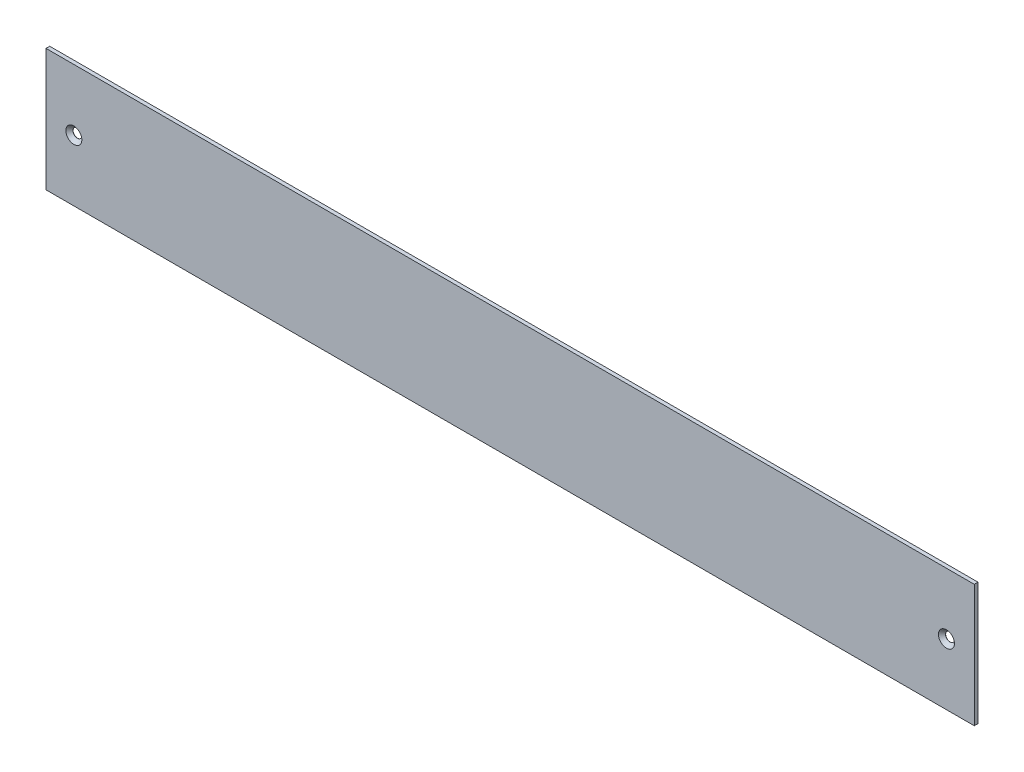
ISO-10303-21;
HEADER;
FILE_DESCRIPTION(('STEP AP214'),'2;1');
FILE_NAME('part.step','',(''),(''),'','','');
FILE_SCHEMA(('AUTOMOTIVE_DESIGN { 1 0 10303 214 1 1 1 1 }'));
ENDSEC;
DATA;
#1=APPLICATION_CONTEXT('core data for automotive mechanical design processes');
#2=APPLICATION_PROTOCOL_DEFINITION('international standard','automotive_design',2000,#1);
#3=PRODUCT_CONTEXT('',#1,'mechanical');
#4=PRODUCT('Part','Part','',(#3));
#5=PRODUCT_RELATED_PRODUCT_CATEGORY('part','',(#4));
#6=PRODUCT_DEFINITION_FORMATION('','',#4);
#7=PRODUCT_DEFINITION_CONTEXT('part definition',#1,'design');
#8=PRODUCT_DEFINITION('design','',#6,#7);
#9=PRODUCT_DEFINITION_SHAPE('','',#8);
#10=(LENGTH_UNIT() NAMED_UNIT(*) SI_UNIT(.MILLI.,.METRE.));
#11=(NAMED_UNIT(*) PLANE_ANGLE_UNIT() SI_UNIT($,.RADIAN.));
#12=(NAMED_UNIT(*) SI_UNIT($,.STERADIAN.) SOLID_ANGLE_UNIT());
#13=UNCERTAINTY_MEASURE_WITH_UNIT(LENGTH_MEASURE(1.E-05),#10,'distance_accuracy_value','');
#14=(GEOMETRIC_REPRESENTATION_CONTEXT(3) GLOBAL_UNCERTAINTY_ASSIGNED_CONTEXT((#13)) GLOBAL_UNIT_ASSIGNED_CONTEXT((#10,
#11,#12)) REPRESENTATION_CONTEXT('',''));
#15=CARTESIAN_POINT('',(0.,0.,0.));
#16=DIRECTION('',(0.,0.,1.));
#17=DIRECTION('',(1.,0.,0.));
#18=AXIS2_PLACEMENT_3D('',#15,#16,#17);
#19=CARTESIAN_POINT('',(-339.903846153846,-63.,2.));
#20=DIRECTION('',(-1.,0.,0.));
#21=DIRECTION('',(0.,-1.,0.));
#22=AXIS2_PLACEMENT_3D('',#19,#20,#21);
#23=PLANE('',#22);
#24=DIRECTION('',(0.,1.,0.));
#25=VECTOR('',#24,1.);
#26=CARTESIAN_POINT('',(-339.903846153846,-63.,0.));
#27=LINE('',#26,#25);
#28=CARTESIAN_POINT('',(-339.903846153846,-63.,0.));
#29=VERTEX_POINT('',#28);
#30=CARTESIAN_POINT('',(-339.903846153846,3.,0.));
#31=VERTEX_POINT('',#30);
#32=EDGE_CURVE('E116',#29,#31,#27,.T.);
#33=ORIENTED_EDGE('',*,*,#32,.F.);
#34=DIRECTION('',(0.,0.,-1.));
#35=VECTOR('',#34,1.);
#36=CARTESIAN_POINT('',(-339.903846153846,-63.,2.));
#37=LINE('',#36,#35);
#38=CARTESIAN_POINT('',(-339.903846153846,-63.,2.));
#39=VERTEX_POINT('',#38);
#40=EDGE_CURVE('E12',#39,#29,#37,.T.);
#41=ORIENTED_EDGE('',*,*,#40,.F.);
#42=DIRECTION('',(0.,1.,0.));
#43=VECTOR('',#42,1.);
#44=CARTESIAN_POINT('',(-339.903846153846,-63.,2.));
#45=LINE('',#44,#43);
#46=CARTESIAN_POINT('',(-339.903846153846,3.,2.));
#47=VERTEX_POINT('',#46);
#48=EDGE_CURVE('E109',#39,#47,#45,.T.);
#49=ORIENTED_EDGE('',*,*,#48,.T.);
#50=DIRECTION('',(0.,0.,-1.));
#51=VECTOR('',#50,1.);
#52=CARTESIAN_POINT('',(-339.903846153846,3.,2.));
#53=LINE('',#52,#51);
#54=EDGE_CURVE('E50',#47,#31,#53,.T.);
#55=ORIENTED_EDGE('',*,*,#54,.T.);
#56=EDGE_LOOP('',(#33,#41,#49,#55));
#57=FACE_BOUND('',#56,.T.);
#58=ADVANCED_FACE('F47',(#57),#23,.T.);
#59=CARTESIAN_POINT('',(-339.903846153846,-63.,2.));
#60=DIRECTION('',(0.,1.,0.));
#61=DIRECTION('',(-1.,0.,0.));
#62=AXIS2_PLACEMENT_3D('',#59,#60,#61);
#63=PLANE('',#62);
#64=DIRECTION('',(1.,0.,0.));
#65=VECTOR('',#64,1.);
#66=CARTESIAN_POINT('',(-339.903846153846,-63.,0.));
#67=LINE('',#66,#65);
#68=CARTESIAN_POINT('',(160.096153846153,-62.9999999999999,0.));
#69=VERTEX_POINT('',#68);
#70=EDGE_CURVE('E79',#29,#69,#67,.T.);
#71=ORIENTED_EDGE('',*,*,#70,.T.);
#72=DIRECTION('',(0.,0.,-1.));
#73=VECTOR('',#72,1.);
#74=CARTESIAN_POINT('',(160.096153846153,-62.9999999999999,2.));
#75=LINE('',#74,#73);
#76=CARTESIAN_POINT('',(160.096153846153,-62.9999999999999,2.));
#77=VERTEX_POINT('',#76);
#78=EDGE_CURVE('E57',#77,#69,#75,.T.);
#79=ORIENTED_EDGE('',*,*,#78,.F.);
#80=DIRECTION('',(-1.,0.,0.));
#81=VECTOR('',#80,1.);
#82=CARTESIAN_POINT('',(160.096153846153,-62.9999999999999,2.));
#83=LINE('',#82,#81);
#84=EDGE_CURVE('E65',#77,#39,#83,.T.);
#85=ORIENTED_EDGE('',*,*,#84,.T.);
#86=ORIENTED_EDGE('',*,*,#40,.T.);
#87=EDGE_LOOP('',(#71,#79,#85,#86));
#88=FACE_BOUND('',#87,.T.);
#89=ADVANCED_FACE('F177',(#88),#63,.F.);
#90=CARTESIAN_POINT('',(160.096153846154,3.,2.));
#91=DIRECTION('',(1.,0.,0.));
#92=DIRECTION('',(0.,1.,0.));
#93=AXIS2_PLACEMENT_3D('',#90,#91,#92);
#94=PLANE('',#93);
#95=DIRECTION('',(0.,-1.,0.));
#96=VECTOR('',#95,1.);
#97=CARTESIAN_POINT('',(160.096153846154,3.,0.));
#98=LINE('',#97,#96);
#99=CARTESIAN_POINT('',(160.096153846154,3.,0.));
#100=VERTEX_POINT('',#99);
#101=EDGE_CURVE('E97',#100,#69,#98,.T.);
#102=ORIENTED_EDGE('',*,*,#101,.F.);
#103=DIRECTION('',(0.,0.,-1.));
#104=VECTOR('',#103,1.);
#105=CARTESIAN_POINT('',(160.096153846154,3.,2.));
#106=LINE('',#105,#104);
#107=CARTESIAN_POINT('',(160.096153846154,3.,2.));
#108=VERTEX_POINT('',#107);
#109=EDGE_CURVE('E92',#108,#100,#106,.T.);
#110=ORIENTED_EDGE('',*,*,#109,.F.);
#111=DIRECTION('',(0.,-1.,0.));
#112=VECTOR('',#111,1.);
#113=CARTESIAN_POINT('',(160.096153846154,3.,2.));
#114=LINE('',#113,#112);
#115=EDGE_CURVE('E95',#108,#77,#114,.T.);
#116=ORIENTED_EDGE('',*,*,#115,.T.);
#117=ORIENTED_EDGE('',*,*,#78,.T.);
#118=EDGE_LOOP('',(#102,#110,#116,#117));
#119=FACE_BOUND('',#118,.T.);
#120=ADVANCED_FACE('F94',(#119),#94,.T.);
#121=CARTESIAN_POINT('',(-339.903846153846,3.,2.));
#122=DIRECTION('',(0.,1.,0.));
#123=DIRECTION('',(0.,0.,1.));
#124=AXIS2_PLACEMENT_3D('',#121,#122,#123);
#125=PLANE('',#124);
#126=DIRECTION('',(1.,0.,0.));
#127=VECTOR('',#126,1.);
#128=CARTESIAN_POINT('',(-339.903846153846,3.,0.));
#129=LINE('',#128,#127);
#130=EDGE_CURVE('E121',#31,#100,#129,.T.);
#131=ORIENTED_EDGE('',*,*,#130,.F.);
#132=ORIENTED_EDGE('',*,*,#54,.F.);
#133=DIRECTION('',(1.,0.,0.));
#134=VECTOR('',#133,1.);
#135=CARTESIAN_POINT('',(-339.903846153846,3.,2.));
#136=LINE('',#135,#134);
#137=EDGE_CURVE('E103',#47,#108,#136,.T.);
#138=ORIENTED_EDGE('',*,*,#137,.T.);
#139=ORIENTED_EDGE('',*,*,#109,.T.);
#140=EDGE_LOOP('',(#131,#132,#138,#139));
#141=FACE_BOUND('',#140,.T.);
#142=ADVANCED_FACE('F107',(#141),#125,.T.);
#143=CARTESIAN_POINT('',(0.,0.,2.));
#144=DIRECTION('',(0.,0.,-1.));
#145=DIRECTION('',(-1.,0.,0.));
#146=AXIS2_PLACEMENT_3D('',#143,#144,#145);
#147=PLANE('',#146);
#148=CARTESIAN_POINT('',(-324.903846153846,-30.,2.));
#149=DIRECTION('',(0.,0.,1.));
#150=DIRECTION('',(1.,0.,0.));
#151=AXIS2_PLACEMENT_3D('',#148,#149,#150);
#152=CIRCLE('',#151,4.30000000000003);
#153=CARTESIAN_POINT('',(-320.603846153846,-30.,2.));
#154=VERTEX_POINT('',#153);
#155=EDGE_CURVE('E203',#154,#154,#152,.T.);
#156=ORIENTED_EDGE('',*,*,#155,.F.);
#157=EDGE_LOOP('',(#156));
#158=FACE_BOUND('',#157,.T.);
#159=CARTESIAN_POINT('',(145.096153846153,-30.,2.));
#160=DIRECTION('',(0.,0.,1.));
#161=DIRECTION('',(1.,0.,0.));
#162=AXIS2_PLACEMENT_3D('',#159,#160,#161);
#163=CIRCLE('',#162,4.3);
#164=CARTESIAN_POINT('',(149.396153846153,-30.,2.));
#165=VERTEX_POINT('',#164);
#166=EDGE_CURVE('E137',#165,#165,#163,.T.);
#167=ORIENTED_EDGE('',*,*,#166,.F.);
#168=EDGE_LOOP('',(#167));
#169=FACE_BOUND('',#168,.T.);
#170=ORIENTED_EDGE('',*,*,#48,.F.);
#171=ORIENTED_EDGE('',*,*,#84,.F.);
#172=ORIENTED_EDGE('',*,*,#115,.F.);
#173=ORIENTED_EDGE('',*,*,#137,.F.);
#174=EDGE_LOOP('',(#170,#171,#172,#173));
#175=FACE_BOUND('',#174,.T.);
#176=ADVANCED_FACE('F102',(#158,#169,#175),#147,.F.);
#177=CARTESIAN_POINT('',(0.,0.,0.));
#178=DIRECTION('',(0.,0.,-1.));
#179=DIRECTION('',(-1.,0.,0.));
#180=AXIS2_PLACEMENT_3D('',#177,#178,#179);
#181=PLANE('',#180);
#182=ORIENTED_EDGE('',*,*,#101,.T.);
#183=ORIENTED_EDGE('',*,*,#70,.F.);
#184=ORIENTED_EDGE('',*,*,#32,.T.);
#185=ORIENTED_EDGE('',*,*,#130,.T.);
#186=EDGE_LOOP('',(#182,#183,#184,#185));
#187=FACE_BOUND('',#186,.T.);
#188=CARTESIAN_POINT('',(-324.903846153846,-30.,0.));
#189=DIRECTION('',(0.,0.,1.));
#190=DIRECTION('',(1.,0.,0.));
#191=AXIS2_PLACEMENT_3D('',#188,#189,#190);
#192=CIRCLE('',#191,2.40000000000001);
#193=CARTESIAN_POINT('',(-322.503846153846,-30.,0.));
#194=VERTEX_POINT('',#193);
#195=EDGE_CURVE('E131',#194,#194,#192,.T.);
#196=ORIENTED_EDGE('',*,*,#195,.T.);
#197=EDGE_LOOP('',(#196));
#198=FACE_BOUND('',#197,.T.);
#199=CARTESIAN_POINT('',(145.096153846153,-30.,0.));
#200=DIRECTION('',(0.,0.,1.));
#201=DIRECTION('',(1.,0.,0.));
#202=AXIS2_PLACEMENT_3D('',#199,#200,#201);
#203=CIRCLE('',#202,2.40000000000001);
#204=CARTESIAN_POINT('',(147.496153846154,-30.,0.));
#205=VERTEX_POINT('',#204);
#206=EDGE_CURVE('E122',#205,#205,#203,.T.);
#207=ORIENTED_EDGE('',*,*,#206,.T.);
#208=EDGE_LOOP('',(#207));
#209=FACE_BOUND('',#208,.T.);
#210=ADVANCED_FACE('F151',(#187,#198,#209),#181,.T.);
#211=CARTESIAN_POINT('',(145.096153846153,-30.,2.));
#212=DIRECTION('',(0.,0.,1.));
#213=DIRECTION('',(1.,0.,0.));
#214=AXIS2_PLACEMENT_3D('',#211,#212,#213);
#215=CYLINDRICAL_SURFACE('',#214,2.40000000000001);
#216=ORIENTED_EDGE('',*,*,#206,.F.);
#217=EDGE_LOOP('',(#216));
#218=FACE_BOUND('',#217,.T.);
#219=CARTESIAN_POINT('',(145.096153846153,-30.,0.1));
#220=DIRECTION('',(0.,0.,1.));
#221=DIRECTION('',(1.,0.,0.));
#222=AXIS2_PLACEMENT_3D('',#219,#220,#221);
#223=CIRCLE('',#222,2.40000000000001);
#224=CARTESIAN_POINT('',(147.496153846154,-30.,0.1));
#225=VERTEX_POINT('',#224);
#226=EDGE_CURVE('E143',#225,#225,#223,.T.);
#227=ORIENTED_EDGE('',*,*,#226,.T.);
#228=EDGE_LOOP('',(#227));
#229=FACE_BOUND('',#228,.T.);
#230=ADVANCED_FACE('F153',(#218,#229),#215,.F.);
#231=CARTESIAN_POINT('',(145.096153846153,-30.,2.));
#232=DIRECTION('',(0.,0.,1.));
#233=DIRECTION('',(1.,0.,0.));
#234=AXIS2_PLACEMENT_3D('',#231,#232,#233);
#235=CONICAL_SURFACE('',#234,4.3,0.785398163397445);
#236=ORIENTED_EDGE('',*,*,#226,.F.);
#237=EDGE_LOOP('',(#236));
#238=FACE_BOUND('',#237,.T.);
#239=ORIENTED_EDGE('',*,*,#166,.T.);
#240=EDGE_LOOP('',(#239));
#241=FACE_BOUND('',#240,.T.);
#242=ADVANCED_FACE('F156',(#238,#241),#235,.F.);
#243=CARTESIAN_POINT('',(-324.903846153846,-30.,2.));
#244=DIRECTION('',(0.,0.,1.));
#245=DIRECTION('',(1.,0.,0.));
#246=AXIS2_PLACEMENT_3D('',#243,#244,#245);
#247=CYLINDRICAL_SURFACE('',#246,2.40000000000001);
#248=ORIENTED_EDGE('',*,*,#195,.F.);
#249=EDGE_LOOP('',(#248));
#250=FACE_BOUND('',#249,.T.);
#251=CARTESIAN_POINT('',(-324.903846153846,-30.,0.1));
#252=DIRECTION('',(0.,0.,1.));
#253=DIRECTION('',(1.,0.,0.));
#254=AXIS2_PLACEMENT_3D('',#251,#252,#253);
#255=CIRCLE('',#254,2.40000000000001);
#256=CARTESIAN_POINT('',(-322.503846153846,-30.,0.1));
#257=VERTEX_POINT('',#256);
#258=EDGE_CURVE('E138',#257,#257,#255,.T.);
#259=ORIENTED_EDGE('',*,*,#258,.T.);
#260=EDGE_LOOP('',(#259));
#261=FACE_BOUND('',#260,.T.);
#262=ADVANCED_FACE('F162',(#250,#261),#247,.F.);
#263=CARTESIAN_POINT('',(-324.903846153846,-30.,2.));
#264=DIRECTION('',(0.,0.,1.));
#265=DIRECTION('',(1.,0.,0.));
#266=AXIS2_PLACEMENT_3D('',#263,#264,#265);
#267=CONICAL_SURFACE('',#266,4.30000000000003,0.785398163397452);
#268=ORIENTED_EDGE('',*,*,#258,.F.);
#269=EDGE_LOOP('',(#268));
#270=FACE_BOUND('',#269,.T.);
#271=ORIENTED_EDGE('',*,*,#155,.T.);
#272=EDGE_LOOP('',(#271));
#273=FACE_BOUND('',#272,.T.);
#274=ADVANCED_FACE('F197',(#270,#273),#267,.F.);
#275=CLOSED_SHELL('',(#58,#89,#120,#142,#176,#210,#230,#242,#262,#274));
#276=MANIFOLD_SOLID_BREP('B2',#275);
#277=ADVANCED_BREP_SHAPE_REPRESENTATION('',(#18,#276),#14);
#278=SHAPE_DEFINITION_REPRESENTATION(#9,#277);
ENDSEC;
END-ISO-10303-21;
